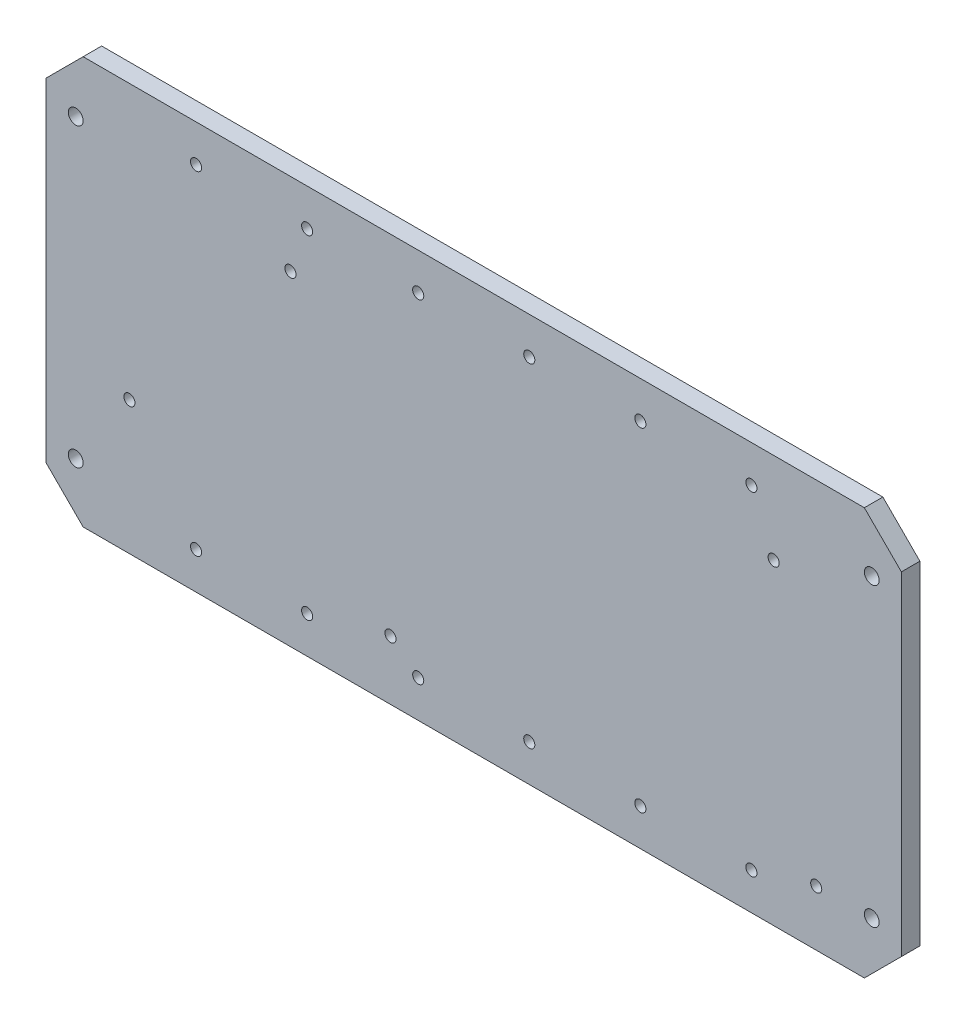
ISO-10303-21;
HEADER;
FILE_DESCRIPTION(('STEP AP214'),'2;1');
FILE_NAME('part.step','',(''),(''),'','','');
FILE_SCHEMA(('AUTOMOTIVE_DESIGN { 1 0 10303 214 1 1 1 1 }'));
ENDSEC;
DATA;
#1=APPLICATION_CONTEXT('core data for automotive mechanical design processes');
#2=APPLICATION_PROTOCOL_DEFINITION('international standard','automotive_design',2000,#1);
#3=PRODUCT_CONTEXT('',#1,'mechanical');
#4=PRODUCT('Part','Part','',(#3));
#5=PRODUCT_RELATED_PRODUCT_CATEGORY('part','',(#4));
#6=PRODUCT_DEFINITION_FORMATION('','',#4);
#7=PRODUCT_DEFINITION_CONTEXT('part definition',#1,'design');
#8=PRODUCT_DEFINITION('design','',#6,#7);
#9=PRODUCT_DEFINITION_SHAPE('','',#8);
#10=(LENGTH_UNIT() NAMED_UNIT(*) SI_UNIT(.MILLI.,.METRE.));
#11=(NAMED_UNIT(*) PLANE_ANGLE_UNIT() SI_UNIT($,.RADIAN.));
#12=(NAMED_UNIT(*) SI_UNIT($,.STERADIAN.) SOLID_ANGLE_UNIT());
#13=UNCERTAINTY_MEASURE_WITH_UNIT(LENGTH_MEASURE(1.E-05),#10,'distance_accuracy_value','');
#14=(GEOMETRIC_REPRESENTATION_CONTEXT(3) GLOBAL_UNCERTAINTY_ASSIGNED_CONTEXT((#13)) GLOBAL_UNIT_ASSIGNED_CONTEXT((#10,
#11,#12)) REPRESENTATION_CONTEXT('',''));
#15=CARTESIAN_POINT('',(0.,0.,0.));
#16=DIRECTION('',(0.,0.,1.));
#17=DIRECTION('',(1.,0.,0.));
#18=AXIS2_PLACEMENT_3D('',#15,#16,#17);
#19=CARTESIAN_POINT('',(0.,0.,5.));
#20=DIRECTION('',(0.,0.,-1.));
#21=DIRECTION('',(-1.,0.,0.));
#22=AXIS2_PLACEMENT_3D('',#19,#20,#21);
#23=PLANE('',#22);
#24=DIRECTION('',(0.,-1.,0.));
#25=VECTOR('',#24,1.);
#26=CARTESIAN_POINT('',(0.,0.,5.));
#27=LINE('',#26,#25);
#28=CARTESIAN_POINT('',(0.,100.,5.));
#29=VERTEX_POINT('',#28);
#30=CARTESIAN_POINT('',(0.,10.,5.));
#31=VERTEX_POINT('',#30);
#32=EDGE_CURVE('E137',#29,#31,#27,.T.);
#33=ORIENTED_EDGE('',*,*,#32,.T.);
#34=DIRECTION('',(-0.707106781186548,0.707106781186548,0.));
#35=VECTOR('',#34,1.);
#36=CARTESIAN_POINT('',(10.,0.,5.));
#37=LINE('',#36,#35);
#38=CARTESIAN_POINT('',(10.,0.,5.));
#39=VERTEX_POINT('',#38);
#40=EDGE_CURVE('E152',#31,#39,#37,.F.);
#41=ORIENTED_EDGE('',*,*,#40,.T.);
#42=DIRECTION('',(1.,0.,0.));
#43=VECTOR('',#42,1.);
#44=CARTESIAN_POINT('',(0.,0.,5.));
#45=LINE('',#44,#43);
#46=CARTESIAN_POINT('',(221.,0.,5.));
#47=VERTEX_POINT('',#46);
#48=EDGE_CURVE('E119',#39,#47,#45,.T.);
#49=ORIENTED_EDGE('',*,*,#48,.T.);
#50=DIRECTION('',(-0.707106781186548,-0.707106781186548,0.));
#51=VECTOR('',#50,1.);
#52=CARTESIAN_POINT('',(231.,10.,5.));
#53=LINE('',#52,#51);
#54=CARTESIAN_POINT('',(231.,10.,5.));
#55=VERTEX_POINT('',#54);
#56=EDGE_CURVE('E150',#47,#55,#53,.F.);
#57=ORIENTED_EDGE('',*,*,#56,.T.);
#58=DIRECTION('',(0.,1.,0.));
#59=VECTOR('',#58,1.);
#60=CARTESIAN_POINT('',(231.,0.,5.));
#61=LINE('',#60,#59);
#62=CARTESIAN_POINT('',(231.,100.,5.));
#63=VERTEX_POINT('',#62);
#64=EDGE_CURVE('E163',#55,#63,#61,.T.);
#65=ORIENTED_EDGE('',*,*,#64,.T.);
#66=DIRECTION('',(0.707106781186548,-0.707106781186548,0.));
#67=VECTOR('',#66,1.);
#68=CARTESIAN_POINT('',(221.,110.,5.));
#69=LINE('',#68,#67);
#70=CARTESIAN_POINT('',(221.,110.,5.));
#71=VERTEX_POINT('',#70);
#72=EDGE_CURVE('E54',#63,#71,#69,.F.);
#73=ORIENTED_EDGE('',*,*,#72,.T.);
#74=DIRECTION('',(-1.,0.,0.));
#75=VECTOR('',#74,1.);
#76=CARTESIAN_POINT('',(0.,110.,5.));
#77=LINE('',#76,#75);
#78=CARTESIAN_POINT('',(10.,110.,5.));
#79=VERTEX_POINT('',#78);
#80=EDGE_CURVE('E138',#71,#79,#77,.T.);
#81=ORIENTED_EDGE('',*,*,#80,.T.);
#82=DIRECTION('',(0.70710678118655,0.707106781186545,0.));
#83=VECTOR('',#82,1.);
#84=CARTESIAN_POINT('',(0.,100.,5.));
#85=LINE('',#84,#83);
#86=EDGE_CURVE('E147',#79,#29,#85,.F.);
#87=ORIENTED_EDGE('',*,*,#86,.T.);
#88=EDGE_LOOP('',(#33,#41,#49,#57,#65,#73,#81,#87));
#89=FACE_BOUND('',#88,.T.);
#90=CARTESIAN_POINT('',(196.5,85.5,5.));
#91=DIRECTION('',(0.,0.,1.));
#92=DIRECTION('',(1.,0.,0.));
#93=AXIS2_PLACEMENT_3D('',#90,#91,#92);
#94=CIRCLE('',#93,1.5);
#95=CARTESIAN_POINT('',(198.,85.5,5.));
#96=VERTEX_POINT('',#95);
#97=EDGE_CURVE('E132',#96,#96,#94,.T.);
#98=ORIENTED_EDGE('',*,*,#97,.F.);
#99=EDGE_LOOP('',(#98));
#100=FACE_BOUND('',#99,.T.);
#101=CARTESIAN_POINT('',(93.,16.,5.));
#102=DIRECTION('',(0.,0.,1.));
#103=DIRECTION('',(1.,0.,0.));
#104=AXIS2_PLACEMENT_3D('',#101,#102,#103);
#105=CIRCLE('',#104,1.5);
#106=CARTESIAN_POINT('',(94.5,16.,5.));
#107=VERTEX_POINT('',#106);
#108=EDGE_CURVE('E180',#107,#107,#105,.T.);
#109=ORIENTED_EDGE('',*,*,#108,.F.);
#110=EDGE_LOOP('',(#109));
#111=FACE_BOUND('',#110,.T.);
#112=CARTESIAN_POINT('',(66.,87.8,5.));
#113=DIRECTION('',(0.,0.,1.));
#114=DIRECTION('',(1.,0.,0.));
#115=AXIS2_PLACEMENT_3D('',#112,#113,#114);
#116=CIRCLE('',#115,1.5);
#117=CARTESIAN_POINT('',(67.5,87.8,5.));
#118=VERTEX_POINT('',#117);
#119=EDGE_CURVE('E186',#118,#118,#116,.T.);
#120=ORIENTED_EDGE('',*,*,#119,.F.);
#121=EDGE_LOOP('',(#120));
#122=FACE_BOUND('',#121,.T.);
#123=CARTESIAN_POINT('',(22.5,36.,5.));
#124=DIRECTION('',(0.,0.,1.));
#125=DIRECTION('',(1.,0.,0.));
#126=AXIS2_PLACEMENT_3D('',#123,#124,#125);
#127=CIRCLE('',#126,1.5);
#128=CARTESIAN_POINT('',(24.,36.,5.));
#129=VERTEX_POINT('',#128);
#130=EDGE_CURVE('E192',#129,#129,#127,.T.);
#131=ORIENTED_EDGE('',*,*,#130,.F.);
#132=EDGE_LOOP('',(#131));
#133=FACE_BOUND('',#132,.T.);
#134=CARTESIAN_POINT('',(223.,95.,5.));
#135=DIRECTION('',(0.,0.,1.));
#136=DIRECTION('',(1.,0.,0.));
#137=AXIS2_PLACEMENT_3D('',#134,#135,#136);
#138=CIRCLE('',#137,2.);
#139=CARTESIAN_POINT('',(225.,95.,5.));
#140=VERTEX_POINT('',#139);
#141=EDGE_CURVE('E198',#140,#140,#138,.T.);
#142=ORIENTED_EDGE('',*,*,#141,.F.);
#143=EDGE_LOOP('',(#142));
#144=FACE_BOUND('',#143,.T.);
#145=CARTESIAN_POINT('',(223.,15.,5.));
#146=DIRECTION('',(0.,0.,1.));
#147=DIRECTION('',(1.,0.,0.));
#148=AXIS2_PLACEMENT_3D('',#145,#146,#147);
#149=CIRCLE('',#148,2.);
#150=CARTESIAN_POINT('',(225.,15.,5.));
#151=VERTEX_POINT('',#150);
#152=EDGE_CURVE('E204',#151,#151,#149,.T.);
#153=ORIENTED_EDGE('',*,*,#152,.F.);
#154=EDGE_LOOP('',(#153));
#155=FACE_BOUND('',#154,.T.);
#156=CARTESIAN_POINT('',(8.00000000000001,95.,5.));
#157=DIRECTION('',(0.,0.,1.));
#158=DIRECTION('',(-1.,0.,0.));
#159=AXIS2_PLACEMENT_3D('',#156,#157,#158);
#160=CIRCLE('',#159,2.);
#161=CARTESIAN_POINT('',(6.00000000000001,95.,5.));
#162=VERTEX_POINT('',#161);
#163=EDGE_CURVE('E210',#162,#162,#160,.T.);
#164=ORIENTED_EDGE('',*,*,#163,.F.);
#165=EDGE_LOOP('',(#164));
#166=FACE_BOUND('',#165,.T.);
#167=CARTESIAN_POINT('',(8.00000000000001,15.,5.));
#168=DIRECTION('',(0.,0.,1.));
#169=DIRECTION('',(-1.,0.,0.));
#170=AXIS2_PLACEMENT_3D('',#167,#168,#169);
#171=CIRCLE('',#170,2.);
#172=CARTESIAN_POINT('',(6.00000000000001,15.,5.));
#173=VERTEX_POINT('',#172);
#174=EDGE_CURVE('E216',#173,#173,#171,.T.);
#175=ORIENTED_EDGE('',*,*,#174,.F.);
#176=EDGE_LOOP('',(#175));
#177=FACE_BOUND('',#176,.T.);
#178=CARTESIAN_POINT('',(208.,15.,5.));
#179=DIRECTION('',(0.,0.,1.));
#180=DIRECTION('',(1.,0.,0.));
#181=AXIS2_PLACEMENT_3D('',#178,#179,#180);
#182=CIRCLE('',#181,1.5);
#183=CARTESIAN_POINT('',(209.5,15.,5.));
#184=VERTEX_POINT('',#183);
#185=EDGE_CURVE('E222',#184,#184,#182,.T.);
#186=ORIENTED_EDGE('',*,*,#185,.F.);
#187=EDGE_LOOP('',(#186));
#188=FACE_BOUND('',#187,.T.);
#189=CARTESIAN_POINT('',(130.5,100.,5.));
#190=DIRECTION('',(0.,0.,1.));
#191=DIRECTION('',(1.,0.,0.));
#192=AXIS2_PLACEMENT_3D('',#189,#190,#191);
#193=CIRCLE('',#192,1.5);
#194=CARTESIAN_POINT('',(132.,100.,5.));
#195=VERTEX_POINT('',#194);
#196=EDGE_CURVE('E228',#195,#195,#193,.T.);
#197=ORIENTED_EDGE('',*,*,#196,.F.);
#198=EDGE_LOOP('',(#197));
#199=FACE_BOUND('',#198,.T.);
#200=CARTESIAN_POINT('',(160.5,100.,5.));
#201=DIRECTION('',(0.,0.,1.));
#202=DIRECTION('',(1.,0.,0.));
#203=AXIS2_PLACEMENT_3D('',#200,#201,#202);
#204=CIRCLE('',#203,1.5);
#205=CARTESIAN_POINT('',(162.,100.,5.));
#206=VERTEX_POINT('',#205);
#207=EDGE_CURVE('E234',#206,#206,#204,.T.);
#208=ORIENTED_EDGE('',*,*,#207,.F.);
#209=EDGE_LOOP('',(#208));
#210=FACE_BOUND('',#209,.T.);
#211=CARTESIAN_POINT('',(190.5,100.,5.));
#212=DIRECTION('',(0.,0.,1.));
#213=DIRECTION('',(1.,0.,0.));
#214=AXIS2_PLACEMENT_3D('',#211,#212,#213);
#215=CIRCLE('',#214,1.5);
#216=CARTESIAN_POINT('',(192.,100.,5.));
#217=VERTEX_POINT('',#216);
#218=EDGE_CURVE('E240',#217,#217,#215,.T.);
#219=ORIENTED_EDGE('',*,*,#218,.F.);
#220=EDGE_LOOP('',(#219));
#221=FACE_BOUND('',#220,.T.);
#222=CARTESIAN_POINT('',(40.5,100.,5.));
#223=DIRECTION('',(0.,0.,1.));
#224=DIRECTION('',(-1.,0.,0.));
#225=AXIS2_PLACEMENT_3D('',#222,#223,#224);
#226=CIRCLE('',#225,1.5);
#227=CARTESIAN_POINT('',(39.,100.,5.));
#228=VERTEX_POINT('',#227);
#229=EDGE_CURVE('E246',#228,#228,#226,.T.);
#230=ORIENTED_EDGE('',*,*,#229,.F.);
#231=EDGE_LOOP('',(#230));
#232=FACE_BOUND('',#231,.T.);
#233=CARTESIAN_POINT('',(70.5,100.,5.));
#234=DIRECTION('',(0.,0.,1.));
#235=DIRECTION('',(-1.,0.,0.));
#236=AXIS2_PLACEMENT_3D('',#233,#234,#235);
#237=CIRCLE('',#236,1.5);
#238=CARTESIAN_POINT('',(69.,100.,5.));
#239=VERTEX_POINT('',#238);
#240=EDGE_CURVE('E252',#239,#239,#237,.T.);
#241=ORIENTED_EDGE('',*,*,#240,.F.);
#242=EDGE_LOOP('',(#241));
#243=FACE_BOUND('',#242,.T.);
#244=CARTESIAN_POINT('',(100.5,100.,5.));
#245=DIRECTION('',(0.,0.,1.));
#246=DIRECTION('',(-1.,0.,0.));
#247=AXIS2_PLACEMENT_3D('',#244,#245,#246);
#248=CIRCLE('',#247,1.5);
#249=CARTESIAN_POINT('',(99.,100.,5.));
#250=VERTEX_POINT('',#249);
#251=EDGE_CURVE('E258',#250,#250,#248,.T.);
#252=ORIENTED_EDGE('',*,*,#251,.F.);
#253=EDGE_LOOP('',(#252));
#254=FACE_BOUND('',#253,.T.);
#255=CARTESIAN_POINT('',(100.5,9.99999999999999,5.));
#256=DIRECTION('',(0.,0.,1.));
#257=DIRECTION('',(1.,0.,0.));
#258=AXIS2_PLACEMENT_3D('',#255,#256,#257);
#259=CIRCLE('',#258,1.5);
#260=CARTESIAN_POINT('',(102.,9.99999999999999,5.));
#261=VERTEX_POINT('',#260);
#262=EDGE_CURVE('E264',#261,#261,#259,.T.);
#263=ORIENTED_EDGE('',*,*,#262,.F.);
#264=EDGE_LOOP('',(#263));
#265=FACE_BOUND('',#264,.T.);
#266=CARTESIAN_POINT('',(70.5,9.99999999999999,5.));
#267=DIRECTION('',(0.,0.,1.));
#268=DIRECTION('',(1.,0.,0.));
#269=AXIS2_PLACEMENT_3D('',#266,#267,#268);
#270=CIRCLE('',#269,1.5);
#271=CARTESIAN_POINT('',(72.,9.99999999999999,5.));
#272=VERTEX_POINT('',#271);
#273=EDGE_CURVE('E270',#272,#272,#270,.T.);
#274=ORIENTED_EDGE('',*,*,#273,.F.);
#275=EDGE_LOOP('',(#274));
#276=FACE_BOUND('',#275,.T.);
#277=CARTESIAN_POINT('',(40.5,9.99999999999999,5.));
#278=DIRECTION('',(0.,0.,1.));
#279=DIRECTION('',(1.,0.,0.));
#280=AXIS2_PLACEMENT_3D('',#277,#278,#279);
#281=CIRCLE('',#280,1.5);
#282=CARTESIAN_POINT('',(42.,9.99999999999999,5.));
#283=VERTEX_POINT('',#282);
#284=EDGE_CURVE('E276',#283,#283,#281,.T.);
#285=ORIENTED_EDGE('',*,*,#284,.F.);
#286=EDGE_LOOP('',(#285));
#287=FACE_BOUND('',#286,.T.);
#288=CARTESIAN_POINT('',(190.5,9.99999999999999,5.));
#289=DIRECTION('',(0.,0.,1.));
#290=DIRECTION('',(-1.,0.,0.));
#291=AXIS2_PLACEMENT_3D('',#288,#289,#290);
#292=CIRCLE('',#291,1.5);
#293=CARTESIAN_POINT('',(189.,9.99999999999999,5.));
#294=VERTEX_POINT('',#293);
#295=EDGE_CURVE('E282',#294,#294,#292,.T.);
#296=ORIENTED_EDGE('',*,*,#295,.F.);
#297=EDGE_LOOP('',(#296));
#298=FACE_BOUND('',#297,.T.);
#299=CARTESIAN_POINT('',(160.5,9.99999999999999,5.));
#300=DIRECTION('',(0.,0.,1.));
#301=DIRECTION('',(-1.,0.,0.));
#302=AXIS2_PLACEMENT_3D('',#299,#300,#301);
#303=CIRCLE('',#302,1.5);
#304=CARTESIAN_POINT('',(159.,9.99999999999999,5.));
#305=VERTEX_POINT('',#304);
#306=EDGE_CURVE('E288',#305,#305,#303,.T.);
#307=ORIENTED_EDGE('',*,*,#306,.F.);
#308=EDGE_LOOP('',(#307));
#309=FACE_BOUND('',#308,.T.);
#310=CARTESIAN_POINT('',(130.5,9.99999999999999,5.));
#311=DIRECTION('',(0.,0.,1.));
#312=DIRECTION('',(-1.,0.,0.));
#313=AXIS2_PLACEMENT_3D('',#310,#311,#312);
#314=CIRCLE('',#313,1.5);
#315=CARTESIAN_POINT('',(129.,9.99999999999999,5.));
#316=VERTEX_POINT('',#315);
#317=EDGE_CURVE('E294',#316,#316,#314,.T.);
#318=ORIENTED_EDGE('',*,*,#317,.F.);
#319=EDGE_LOOP('',(#318));
#320=FACE_BOUND('',#319,.T.);
#321=ADVANCED_FACE('F33',(#89,#100,#111,#122,#133,#144,#155,#166,#177,#188,#199,#210,#221,#232,
#243,#254,#265,#276,#287,#298,#309,#320),#23,.F.);
#322=CARTESIAN_POINT('',(0.,0.,0.));
#323=DIRECTION('',(0.,0.,-1.));
#324=DIRECTION('',(-1.,0.,0.));
#325=AXIS2_PLACEMENT_3D('',#322,#323,#324);
#326=PLANE('',#325);
#327=CARTESIAN_POINT('',(160.5,9.99999999999999,0.));
#328=DIRECTION('',(0.,0.,1.));
#329=DIRECTION('',(-1.,0.,0.));
#330=AXIS2_PLACEMENT_3D('',#327,#328,#329);
#331=CIRCLE('',#330,1.5);
#332=CARTESIAN_POINT('',(159.,9.99999999999999,0.));
#333=VERTEX_POINT('',#332);
#334=EDGE_CURVE('E291',#333,#333,#331,.T.);
#335=ORIENTED_EDGE('',*,*,#334,.T.);
#336=EDGE_LOOP('',(#335));
#337=FACE_BOUND('',#336,.T.);
#338=CARTESIAN_POINT('',(40.5,9.99999999999999,0.));
#339=DIRECTION('',(0.,0.,1.));
#340=DIRECTION('',(1.,0.,0.));
#341=AXIS2_PLACEMENT_3D('',#338,#339,#340);
#342=CIRCLE('',#341,1.5);
#343=CARTESIAN_POINT('',(42.,9.99999999999999,0.));
#344=VERTEX_POINT('',#343);
#345=EDGE_CURVE('E279',#344,#344,#342,.T.);
#346=ORIENTED_EDGE('',*,*,#345,.T.);
#347=EDGE_LOOP('',(#346));
#348=FACE_BOUND('',#347,.T.);
#349=CARTESIAN_POINT('',(100.5,9.99999999999999,0.));
#350=DIRECTION('',(0.,0.,1.));
#351=DIRECTION('',(1.,0.,0.));
#352=AXIS2_PLACEMENT_3D('',#349,#350,#351);
#353=CIRCLE('',#352,1.5);
#354=CARTESIAN_POINT('',(102.,9.99999999999999,0.));
#355=VERTEX_POINT('',#354);
#356=EDGE_CURVE('E267',#355,#355,#353,.T.);
#357=ORIENTED_EDGE('',*,*,#356,.T.);
#358=EDGE_LOOP('',(#357));
#359=FACE_BOUND('',#358,.T.);
#360=CARTESIAN_POINT('',(70.5,100.,0.));
#361=DIRECTION('',(0.,0.,1.));
#362=DIRECTION('',(-1.,0.,0.));
#363=AXIS2_PLACEMENT_3D('',#360,#361,#362);
#364=CIRCLE('',#363,1.5);
#365=CARTESIAN_POINT('',(69.,100.,0.));
#366=VERTEX_POINT('',#365);
#367=EDGE_CURVE('E255',#366,#366,#364,.T.);
#368=ORIENTED_EDGE('',*,*,#367,.T.);
#369=EDGE_LOOP('',(#368));
#370=FACE_BOUND('',#369,.T.);
#371=CARTESIAN_POINT('',(190.5,100.,0.));
#372=DIRECTION('',(0.,0.,1.));
#373=DIRECTION('',(1.,0.,0.));
#374=AXIS2_PLACEMENT_3D('',#371,#372,#373);
#375=CIRCLE('',#374,1.5);
#376=CARTESIAN_POINT('',(192.,100.,0.));
#377=VERTEX_POINT('',#376);
#378=EDGE_CURVE('E243',#377,#377,#375,.T.);
#379=ORIENTED_EDGE('',*,*,#378,.T.);
#380=EDGE_LOOP('',(#379));
#381=FACE_BOUND('',#380,.T.);
#382=CARTESIAN_POINT('',(130.5,100.,0.));
#383=DIRECTION('',(0.,0.,1.));
#384=DIRECTION('',(1.,0.,0.));
#385=AXIS2_PLACEMENT_3D('',#382,#383,#384);
#386=CIRCLE('',#385,1.5);
#387=CARTESIAN_POINT('',(132.,100.,0.));
#388=VERTEX_POINT('',#387);
#389=EDGE_CURVE('E231',#388,#388,#386,.T.);
#390=ORIENTED_EDGE('',*,*,#389,.T.);
#391=EDGE_LOOP('',(#390));
#392=FACE_BOUND('',#391,.T.);
#393=CARTESIAN_POINT('',(8.00000000000001,15.,0.));
#394=DIRECTION('',(0.,0.,1.));
#395=DIRECTION('',(-1.,0.,0.));
#396=AXIS2_PLACEMENT_3D('',#393,#394,#395);
#397=CIRCLE('',#396,2.);
#398=CARTESIAN_POINT('',(6.00000000000001,15.,0.));
#399=VERTEX_POINT('',#398);
#400=EDGE_CURVE('E219',#399,#399,#397,.T.);
#401=ORIENTED_EDGE('',*,*,#400,.T.);
#402=EDGE_LOOP('',(#401));
#403=FACE_BOUND('',#402,.T.);
#404=CARTESIAN_POINT('',(223.,15.,0.));
#405=DIRECTION('',(0.,0.,1.));
#406=DIRECTION('',(1.,0.,0.));
#407=AXIS2_PLACEMENT_3D('',#404,#405,#406);
#408=CIRCLE('',#407,2.);
#409=CARTESIAN_POINT('',(225.,15.,0.));
#410=VERTEX_POINT('',#409);
#411=EDGE_CURVE('E207',#410,#410,#408,.T.);
#412=ORIENTED_EDGE('',*,*,#411,.T.);
#413=EDGE_LOOP('',(#412));
#414=FACE_BOUND('',#413,.T.);
#415=CARTESIAN_POINT('',(22.5,36.,0.));
#416=DIRECTION('',(0.,0.,1.));
#417=DIRECTION('',(1.,0.,0.));
#418=AXIS2_PLACEMENT_3D('',#415,#416,#417);
#419=CIRCLE('',#418,1.5);
#420=CARTESIAN_POINT('',(24.,36.,0.));
#421=VERTEX_POINT('',#420);
#422=EDGE_CURVE('E195',#421,#421,#419,.T.);
#423=ORIENTED_EDGE('',*,*,#422,.T.);
#424=EDGE_LOOP('',(#423));
#425=FACE_BOUND('',#424,.T.);
#426=CARTESIAN_POINT('',(93.,16.,0.));
#427=DIRECTION('',(0.,0.,1.));
#428=DIRECTION('',(1.,0.,0.));
#429=AXIS2_PLACEMENT_3D('',#426,#427,#428);
#430=CIRCLE('',#429,1.5);
#431=CARTESIAN_POINT('',(94.5,16.,0.));
#432=VERTEX_POINT('',#431);
#433=EDGE_CURVE('E183',#432,#432,#430,.T.);
#434=ORIENTED_EDGE('',*,*,#433,.T.);
#435=EDGE_LOOP('',(#434));
#436=FACE_BOUND('',#435,.T.);
#437=DIRECTION('',(1.,0.,0.));
#438=VECTOR('',#437,1.);
#439=CARTESIAN_POINT('',(0.,0.,0.));
#440=LINE('',#439,#438);
#441=CARTESIAN_POINT('',(10.,0.,0.));
#442=VERTEX_POINT('',#441);
#443=CARTESIAN_POINT('',(221.,0.,0.));
#444=VERTEX_POINT('',#443);
#445=EDGE_CURVE('E116',#442,#444,#440,.T.);
#446=ORIENTED_EDGE('',*,*,#445,.F.);
#447=DIRECTION('',(0.707106781186548,-0.707106781186548,0.));
#448=VECTOR('',#447,1.);
#449=CARTESIAN_POINT('',(5.,5.,0.));
#450=LINE('',#449,#448);
#451=CARTESIAN_POINT('',(0.,10.,0.));
#452=VERTEX_POINT('',#451);
#453=EDGE_CURVE('E99',#442,#452,#450,.F.);
#454=ORIENTED_EDGE('',*,*,#453,.T.);
#455=DIRECTION('',(0.,-1.,0.));
#456=VECTOR('',#455,1.);
#457=CARTESIAN_POINT('',(0.,0.,0.));
#458=LINE('',#457,#456);
#459=CARTESIAN_POINT('',(0.,100.,0.));
#460=VERTEX_POINT('',#459);
#461=EDGE_CURVE('E127',#460,#452,#458,.T.);
#462=ORIENTED_EDGE('',*,*,#461,.F.);
#463=DIRECTION('',(-0.70710678118655,-0.707106781186545,0.));
#464=VECTOR('',#463,1.);
#465=CARTESIAN_POINT('',(-50.,50.0000000000005,0.));
#466=LINE('',#465,#464);
#467=CARTESIAN_POINT('',(10.,110.,0.));
#468=VERTEX_POINT('',#467);
#469=EDGE_CURVE('E120',#460,#468,#466,.F.);
#470=ORIENTED_EDGE('',*,*,#469,.T.);
#471=DIRECTION('',(-1.,0.,0.));
#472=VECTOR('',#471,1.);
#473=CARTESIAN_POINT('',(0.,110.,0.));
#474=LINE('',#473,#472);
#475=CARTESIAN_POINT('',(221.,110.,0.));
#476=VERTEX_POINT('',#475);
#477=EDGE_CURVE('E130',#476,#468,#474,.T.);
#478=ORIENTED_EDGE('',*,*,#477,.F.);
#479=DIRECTION('',(-0.707106781186548,0.707106781186548,0.));
#480=VECTOR('',#479,1.);
#481=CARTESIAN_POINT('',(165.5,165.5,0.));
#482=LINE('',#481,#480);
#483=CARTESIAN_POINT('',(231.,100.,0.));
#484=VERTEX_POINT('',#483);
#485=EDGE_CURVE('E141',#476,#484,#482,.F.);
#486=ORIENTED_EDGE('',*,*,#485,.T.);
#487=DIRECTION('',(0.,1.,0.));
#488=VECTOR('',#487,1.);
#489=CARTESIAN_POINT('',(231.,0.,0.));
#490=LINE('',#489,#488);
#491=CARTESIAN_POINT('',(231.,10.,0.));
#492=VERTEX_POINT('',#491);
#493=EDGE_CURVE('E126',#492,#484,#490,.T.);
#494=ORIENTED_EDGE('',*,*,#493,.F.);
#495=DIRECTION('',(0.707106781186548,0.707106781186548,0.));
#496=VECTOR('',#495,1.);
#497=CARTESIAN_POINT('',(110.5,-110.5,0.));
#498=LINE('',#497,#496);
#499=EDGE_CURVE('E110',#492,#444,#498,.F.);
#500=ORIENTED_EDGE('',*,*,#499,.T.);
#501=EDGE_LOOP('',(#446,#454,#462,#470,#478,#486,#494,#500));
#502=FACE_BOUND('',#501,.T.);
#503=CARTESIAN_POINT('',(196.5,85.5,0.));
#504=DIRECTION('',(0.,0.,1.));
#505=DIRECTION('',(1.,0.,0.));
#506=AXIS2_PLACEMENT_3D('',#503,#504,#505);
#507=CIRCLE('',#506,1.5);
#508=CARTESIAN_POINT('',(198.,85.5,0.));
#509=VERTEX_POINT('',#508);
#510=EDGE_CURVE('E177',#509,#509,#507,.T.);
#511=ORIENTED_EDGE('',*,*,#510,.T.);
#512=EDGE_LOOP('',(#511));
#513=FACE_BOUND('',#512,.T.);
#514=CARTESIAN_POINT('',(66.,87.8,0.));
#515=DIRECTION('',(0.,0.,1.));
#516=DIRECTION('',(1.,0.,0.));
#517=AXIS2_PLACEMENT_3D('',#514,#515,#516);
#518=CIRCLE('',#517,1.5);
#519=CARTESIAN_POINT('',(67.5,87.8,0.));
#520=VERTEX_POINT('',#519);
#521=EDGE_CURVE('E189',#520,#520,#518,.T.);
#522=ORIENTED_EDGE('',*,*,#521,.T.);
#523=EDGE_LOOP('',(#522));
#524=FACE_BOUND('',#523,.T.);
#525=CARTESIAN_POINT('',(223.,95.,0.));
#526=DIRECTION('',(0.,0.,1.));
#527=DIRECTION('',(1.,0.,0.));
#528=AXIS2_PLACEMENT_3D('',#525,#526,#527);
#529=CIRCLE('',#528,2.);
#530=CARTESIAN_POINT('',(225.,95.,0.));
#531=VERTEX_POINT('',#530);
#532=EDGE_CURVE('E201',#531,#531,#529,.T.);
#533=ORIENTED_EDGE('',*,*,#532,.T.);
#534=EDGE_LOOP('',(#533));
#535=FACE_BOUND('',#534,.T.);
#536=CARTESIAN_POINT('',(8.00000000000001,95.,0.));
#537=DIRECTION('',(0.,0.,1.));
#538=DIRECTION('',(-1.,0.,0.));
#539=AXIS2_PLACEMENT_3D('',#536,#537,#538);
#540=CIRCLE('',#539,2.);
#541=CARTESIAN_POINT('',(6.00000000000001,95.,0.));
#542=VERTEX_POINT('',#541);
#543=EDGE_CURVE('E213',#542,#542,#540,.T.);
#544=ORIENTED_EDGE('',*,*,#543,.T.);
#545=EDGE_LOOP('',(#544));
#546=FACE_BOUND('',#545,.T.);
#547=CARTESIAN_POINT('',(208.,15.,0.));
#548=DIRECTION('',(0.,0.,1.));
#549=DIRECTION('',(1.,0.,0.));
#550=AXIS2_PLACEMENT_3D('',#547,#548,#549);
#551=CIRCLE('',#550,1.5);
#552=CARTESIAN_POINT('',(209.5,15.,0.));
#553=VERTEX_POINT('',#552);
#554=EDGE_CURVE('E225',#553,#553,#551,.T.);
#555=ORIENTED_EDGE('',*,*,#554,.T.);
#556=EDGE_LOOP('',(#555));
#557=FACE_BOUND('',#556,.T.);
#558=CARTESIAN_POINT('',(160.5,100.,0.));
#559=DIRECTION('',(0.,0.,1.));
#560=DIRECTION('',(1.,0.,0.));
#561=AXIS2_PLACEMENT_3D('',#558,#559,#560);
#562=CIRCLE('',#561,1.5);
#563=CARTESIAN_POINT('',(162.,100.,0.));
#564=VERTEX_POINT('',#563);
#565=EDGE_CURVE('E237',#564,#564,#562,.T.);
#566=ORIENTED_EDGE('',*,*,#565,.T.);
#567=EDGE_LOOP('',(#566));
#568=FACE_BOUND('',#567,.T.);
#569=CARTESIAN_POINT('',(40.5,100.,0.));
#570=DIRECTION('',(0.,0.,1.));
#571=DIRECTION('',(-1.,0.,0.));
#572=AXIS2_PLACEMENT_3D('',#569,#570,#571);
#573=CIRCLE('',#572,1.5);
#574=CARTESIAN_POINT('',(39.,100.,0.));
#575=VERTEX_POINT('',#574);
#576=EDGE_CURVE('E249',#575,#575,#573,.T.);
#577=ORIENTED_EDGE('',*,*,#576,.T.);
#578=EDGE_LOOP('',(#577));
#579=FACE_BOUND('',#578,.T.);
#580=CARTESIAN_POINT('',(100.5,100.,0.));
#581=DIRECTION('',(0.,0.,1.));
#582=DIRECTION('',(-1.,0.,0.));
#583=AXIS2_PLACEMENT_3D('',#580,#581,#582);
#584=CIRCLE('',#583,1.5);
#585=CARTESIAN_POINT('',(99.,100.,0.));
#586=VERTEX_POINT('',#585);
#587=EDGE_CURVE('E261',#586,#586,#584,.T.);
#588=ORIENTED_EDGE('',*,*,#587,.T.);
#589=EDGE_LOOP('',(#588));
#590=FACE_BOUND('',#589,.T.);
#591=CARTESIAN_POINT('',(70.5,9.99999999999999,0.));
#592=DIRECTION('',(0.,0.,1.));
#593=DIRECTION('',(1.,0.,0.));
#594=AXIS2_PLACEMENT_3D('',#591,#592,#593);
#595=CIRCLE('',#594,1.5);
#596=CARTESIAN_POINT('',(72.,9.99999999999999,0.));
#597=VERTEX_POINT('',#596);
#598=EDGE_CURVE('E273',#597,#597,#595,.T.);
#599=ORIENTED_EDGE('',*,*,#598,.T.);
#600=EDGE_LOOP('',(#599));
#601=FACE_BOUND('',#600,.T.);
#602=CARTESIAN_POINT('',(190.5,9.99999999999999,0.));
#603=DIRECTION('',(0.,0.,1.));
#604=DIRECTION('',(-1.,0.,0.));
#605=AXIS2_PLACEMENT_3D('',#602,#603,#604);
#606=CIRCLE('',#605,1.5);
#607=CARTESIAN_POINT('',(189.,9.99999999999999,0.));
#608=VERTEX_POINT('',#607);
#609=EDGE_CURVE('E285',#608,#608,#606,.T.);
#610=ORIENTED_EDGE('',*,*,#609,.T.);
#611=EDGE_LOOP('',(#610));
#612=FACE_BOUND('',#611,.T.);
#613=CARTESIAN_POINT('',(130.5,9.99999999999999,0.));
#614=DIRECTION('',(0.,0.,1.));
#615=DIRECTION('',(-1.,0.,0.));
#616=AXIS2_PLACEMENT_3D('',#613,#614,#615);
#617=CIRCLE('',#616,1.5);
#618=CARTESIAN_POINT('',(129.,9.99999999999999,0.));
#619=VERTEX_POINT('',#618);
#620=EDGE_CURVE('E297',#619,#619,#617,.T.);
#621=ORIENTED_EDGE('',*,*,#620,.T.);
#622=EDGE_LOOP('',(#621));
#623=FACE_BOUND('',#622,.T.);
#624=ADVANCED_FACE('F123',(#337,#348,#359,#370,#381,#392,#403,#414,#425,#436,#502,#513,#524,
#535,#546,#557,#568,#579,#590,#601,#612,#623),#326,.T.);
#625=CARTESIAN_POINT('',(0.,0.,5.));
#626=DIRECTION('',(1.,0.,0.));
#627=DIRECTION('',(0.,0.,-1.));
#628=AXIS2_PLACEMENT_3D('',#625,#626,#627);
#629=PLANE('',#628);
#630=ORIENTED_EDGE('',*,*,#461,.T.);
#631=DIRECTION('',(0.,0.,1.));
#632=VECTOR('',#631,1.);
#633=CARTESIAN_POINT('',(0.,10.,5.));
#634=LINE('',#633,#632);
#635=EDGE_CURVE('E104',#452,#31,#634,.T.);
#636=ORIENTED_EDGE('',*,*,#635,.T.);
#637=ORIENTED_EDGE('',*,*,#32,.F.);
#638=DIRECTION('',(0.,0.,-1.));
#639=VECTOR('',#638,1.);
#640=CARTESIAN_POINT('',(0.,100.,5.));
#641=LINE('',#640,#639);
#642=EDGE_CURVE('E109',#29,#460,#641,.T.);
#643=ORIENTED_EDGE('',*,*,#642,.T.);
#644=EDGE_LOOP('',(#630,#636,#637,#643));
#645=FACE_BOUND('',#644,.T.);
#646=ADVANCED_FACE('F311',(#645),#629,.F.);
#647=CARTESIAN_POINT('',(0.,0.,5.));
#648=DIRECTION('',(0.,1.,0.));
#649=DIRECTION('',(0.,0.,1.));
#650=AXIS2_PLACEMENT_3D('',#647,#648,#649);
#651=PLANE('',#650);
#652=ORIENTED_EDGE('',*,*,#48,.F.);
#653=DIRECTION('',(0.,0.,-1.));
#654=VECTOR('',#653,1.);
#655=CARTESIAN_POINT('',(10.,0.,5.));
#656=LINE('',#655,#654);
#657=EDGE_CURVE('E103',#39,#442,#656,.T.);
#658=ORIENTED_EDGE('',*,*,#657,.T.);
#659=ORIENTED_EDGE('',*,*,#445,.T.);
#660=DIRECTION('',(0.,0.,1.));
#661=VECTOR('',#660,1.);
#662=CARTESIAN_POINT('',(221.,0.,5.));
#663=LINE('',#662,#661);
#664=EDGE_CURVE('E121',#444,#47,#663,.T.);
#665=ORIENTED_EDGE('',*,*,#664,.T.);
#666=EDGE_LOOP('',(#652,#658,#659,#665));
#667=FACE_BOUND('',#666,.T.);
#668=ADVANCED_FACE('F115',(#667),#651,.F.);
#669=CARTESIAN_POINT('',(231.,0.,5.));
#670=DIRECTION('',(-1.,0.,0.));
#671=DIRECTION('',(0.,0.,1.));
#672=AXIS2_PLACEMENT_3D('',#669,#670,#671);
#673=PLANE('',#672);
#674=ORIENTED_EDGE('',*,*,#64,.F.);
#675=DIRECTION('',(0.,0.,-1.));
#676=VECTOR('',#675,1.);
#677=CARTESIAN_POINT('',(231.,10.,5.));
#678=LINE('',#677,#676);
#679=EDGE_CURVE('E156',#55,#492,#678,.T.);
#680=ORIENTED_EDGE('',*,*,#679,.T.);
#681=ORIENTED_EDGE('',*,*,#493,.T.);
#682=DIRECTION('',(0.,0.,1.));
#683=VECTOR('',#682,1.);
#684=CARTESIAN_POINT('',(231.,100.,5.));
#685=LINE('',#684,#683);
#686=EDGE_CURVE('E154',#484,#63,#685,.T.);
#687=ORIENTED_EDGE('',*,*,#686,.T.);
#688=EDGE_LOOP('',(#674,#680,#681,#687));
#689=FACE_BOUND('',#688,.T.);
#690=ADVANCED_FACE('F161',(#689),#673,.F.);
#691=CARTESIAN_POINT('',(0.,110.,5.));
#692=DIRECTION('',(0.,-1.,0.));
#693=DIRECTION('',(0.,0.,-1.));
#694=AXIS2_PLACEMENT_3D('',#691,#692,#693);
#695=PLANE('',#694);
#696=ORIENTED_EDGE('',*,*,#80,.F.);
#697=DIRECTION('',(0.,0.,-1.));
#698=VECTOR('',#697,1.);
#699=CARTESIAN_POINT('',(221.,110.,5.));
#700=LINE('',#699,#698);
#701=EDGE_CURVE('E11',#71,#476,#700,.T.);
#702=ORIENTED_EDGE('',*,*,#701,.T.);
#703=ORIENTED_EDGE('',*,*,#477,.T.);
#704=DIRECTION('',(0.,0.,1.));
#705=VECTOR('',#704,1.);
#706=CARTESIAN_POINT('',(10.,110.,5.));
#707=LINE('',#706,#705);
#708=EDGE_CURVE('E41',#468,#79,#707,.T.);
#709=ORIENTED_EDGE('',*,*,#708,.T.);
#710=EDGE_LOOP('',(#696,#702,#703,#709));
#711=FACE_BOUND('',#710,.T.);
#712=ADVANCED_FACE('F170',(#711),#695,.F.);
#713=CARTESIAN_POINT('',(196.5,85.5,5.));
#714=DIRECTION('',(0.,0.,-1.));
#715=DIRECTION('',(-1.,0.,0.));
#716=AXIS2_PLACEMENT_3D('',#713,#714,#715);
#717=CYLINDRICAL_SURFACE('',#716,1.5);
#718=ORIENTED_EDGE('',*,*,#97,.T.);
#719=EDGE_LOOP('',(#718));
#720=FACE_BOUND('',#719,.T.);
#721=ORIENTED_EDGE('',*,*,#510,.F.);
#722=EDGE_LOOP('',(#721));
#723=FACE_BOUND('',#722,.T.);
#724=ADVANCED_FACE('F316',(#720,#723),#717,.F.);
#725=CARTESIAN_POINT('',(93.,16.,5.));
#726=DIRECTION('',(0.,0.,-1.));
#727=DIRECTION('',(-1.,0.,0.));
#728=AXIS2_PLACEMENT_3D('',#725,#726,#727);
#729=CYLINDRICAL_SURFACE('',#728,1.5);
#730=ORIENTED_EDGE('',*,*,#108,.T.);
#731=EDGE_LOOP('',(#730));
#732=FACE_BOUND('',#731,.T.);
#733=ORIENTED_EDGE('',*,*,#433,.F.);
#734=EDGE_LOOP('',(#733));
#735=FACE_BOUND('',#734,.T.);
#736=ADVANCED_FACE('F581',(#732,#735),#729,.F.);
#737=CARTESIAN_POINT('',(66.,87.8,5.));
#738=DIRECTION('',(0.,0.,-1.));
#739=DIRECTION('',(-1.,0.,0.));
#740=AXIS2_PLACEMENT_3D('',#737,#738,#739);
#741=CYLINDRICAL_SURFACE('',#740,1.5);
#742=ORIENTED_EDGE('',*,*,#119,.T.);
#743=EDGE_LOOP('',(#742));
#744=FACE_BOUND('',#743,.T.);
#745=ORIENTED_EDGE('',*,*,#521,.F.);
#746=EDGE_LOOP('',(#745));
#747=FACE_BOUND('',#746,.T.);
#748=ADVANCED_FACE('F571',(#744,#747),#741,.F.);
#749=CARTESIAN_POINT('',(22.5,36.,5.));
#750=DIRECTION('',(0.,0.,-1.));
#751=DIRECTION('',(-1.,0.,0.));
#752=AXIS2_PLACEMENT_3D('',#749,#750,#751);
#753=CYLINDRICAL_SURFACE('',#752,1.5);
#754=ORIENTED_EDGE('',*,*,#130,.T.);
#755=EDGE_LOOP('',(#754));
#756=FACE_BOUND('',#755,.T.);
#757=ORIENTED_EDGE('',*,*,#422,.F.);
#758=EDGE_LOOP('',(#757));
#759=FACE_BOUND('',#758,.T.);
#760=ADVANCED_FACE('F561',(#756,#759),#753,.F.);
#761=CARTESIAN_POINT('',(223.,95.,5.));
#762=DIRECTION('',(0.,0.,-1.));
#763=DIRECTION('',(-1.,0.,0.));
#764=AXIS2_PLACEMENT_3D('',#761,#762,#763);
#765=CYLINDRICAL_SURFACE('',#764,2.);
#766=ORIENTED_EDGE('',*,*,#141,.T.);
#767=EDGE_LOOP('',(#766));
#768=FACE_BOUND('',#767,.T.);
#769=ORIENTED_EDGE('',*,*,#532,.F.);
#770=EDGE_LOOP('',(#769));
#771=FACE_BOUND('',#770,.T.);
#772=ADVANCED_FACE('F551',(#768,#771),#765,.F.);
#773=CARTESIAN_POINT('',(223.,15.,5.));
#774=DIRECTION('',(0.,0.,-1.));
#775=DIRECTION('',(-1.,0.,0.));
#776=AXIS2_PLACEMENT_3D('',#773,#774,#775);
#777=CYLINDRICAL_SURFACE('',#776,2.);
#778=ORIENTED_EDGE('',*,*,#152,.T.);
#779=EDGE_LOOP('',(#778));
#780=FACE_BOUND('',#779,.T.);
#781=ORIENTED_EDGE('',*,*,#411,.F.);
#782=EDGE_LOOP('',(#781));
#783=FACE_BOUND('',#782,.T.);
#784=ADVANCED_FACE('F541',(#780,#783),#777,.F.);
#785=CARTESIAN_POINT('',(8.00000000000001,95.,5.));
#786=DIRECTION('',(0.,0.,-1.));
#787=DIRECTION('',(-1.,0.,0.));
#788=AXIS2_PLACEMENT_3D('',#785,#786,#787);
#789=CYLINDRICAL_SURFACE('',#788,2.);
#790=ORIENTED_EDGE('',*,*,#163,.T.);
#791=EDGE_LOOP('',(#790));
#792=FACE_BOUND('',#791,.T.);
#793=ORIENTED_EDGE('',*,*,#543,.F.);
#794=EDGE_LOOP('',(#793));
#795=FACE_BOUND('',#794,.T.);
#796=ADVANCED_FACE('F531',(#792,#795),#789,.F.);
#797=CARTESIAN_POINT('',(8.00000000000001,15.,5.));
#798=DIRECTION('',(0.,0.,-1.));
#799=DIRECTION('',(-1.,0.,0.));
#800=AXIS2_PLACEMENT_3D('',#797,#798,#799);
#801=CYLINDRICAL_SURFACE('',#800,2.);
#802=ORIENTED_EDGE('',*,*,#174,.T.);
#803=EDGE_LOOP('',(#802));
#804=FACE_BOUND('',#803,.T.);
#805=ORIENTED_EDGE('',*,*,#400,.F.);
#806=EDGE_LOOP('',(#805));
#807=FACE_BOUND('',#806,.T.);
#808=ADVANCED_FACE('F521',(#804,#807),#801,.F.);
#809=CARTESIAN_POINT('',(208.,15.,5.));
#810=DIRECTION('',(0.,0.,-1.));
#811=DIRECTION('',(-1.,0.,0.));
#812=AXIS2_PLACEMENT_3D('',#809,#810,#811);
#813=CYLINDRICAL_SURFACE('',#812,1.5);
#814=ORIENTED_EDGE('',*,*,#185,.T.);
#815=EDGE_LOOP('',(#814));
#816=FACE_BOUND('',#815,.T.);
#817=ORIENTED_EDGE('',*,*,#554,.F.);
#818=EDGE_LOOP('',(#817));
#819=FACE_BOUND('',#818,.T.);
#820=ADVANCED_FACE('F511',(#816,#819),#813,.F.);
#821=CARTESIAN_POINT('',(130.5,100.,5.));
#822=DIRECTION('',(0.,0.,-1.));
#823=DIRECTION('',(-1.,0.,0.));
#824=AXIS2_PLACEMENT_3D('',#821,#822,#823);
#825=CYLINDRICAL_SURFACE('',#824,1.5);
#826=ORIENTED_EDGE('',*,*,#196,.T.);
#827=EDGE_LOOP('',(#826));
#828=FACE_BOUND('',#827,.T.);
#829=ORIENTED_EDGE('',*,*,#389,.F.);
#830=EDGE_LOOP('',(#829));
#831=FACE_BOUND('',#830,.T.);
#832=ADVANCED_FACE('F501',(#828,#831),#825,.F.);
#833=CARTESIAN_POINT('',(160.5,100.,5.));
#834=DIRECTION('',(0.,0.,-1.));
#835=DIRECTION('',(-1.,0.,0.));
#836=AXIS2_PLACEMENT_3D('',#833,#834,#835);
#837=CYLINDRICAL_SURFACE('',#836,1.5);
#838=ORIENTED_EDGE('',*,*,#207,.T.);
#839=EDGE_LOOP('',(#838));
#840=FACE_BOUND('',#839,.T.);
#841=ORIENTED_EDGE('',*,*,#565,.F.);
#842=EDGE_LOOP('',(#841));
#843=FACE_BOUND('',#842,.T.);
#844=ADVANCED_FACE('F491',(#840,#843),#837,.F.);
#845=CARTESIAN_POINT('',(190.5,100.,5.));
#846=DIRECTION('',(0.,0.,-1.));
#847=DIRECTION('',(-1.,0.,0.));
#848=AXIS2_PLACEMENT_3D('',#845,#846,#847);
#849=CYLINDRICAL_SURFACE('',#848,1.5);
#850=ORIENTED_EDGE('',*,*,#218,.T.);
#851=EDGE_LOOP('',(#850));
#852=FACE_BOUND('',#851,.T.);
#853=ORIENTED_EDGE('',*,*,#378,.F.);
#854=EDGE_LOOP('',(#853));
#855=FACE_BOUND('',#854,.T.);
#856=ADVANCED_FACE('F481',(#852,#855),#849,.F.);
#857=CARTESIAN_POINT('',(40.5,100.,5.));
#858=DIRECTION('',(0.,0.,-1.));
#859=DIRECTION('',(-1.,0.,0.));
#860=AXIS2_PLACEMENT_3D('',#857,#858,#859);
#861=CYLINDRICAL_SURFACE('',#860,1.5);
#862=ORIENTED_EDGE('',*,*,#229,.T.);
#863=EDGE_LOOP('',(#862));
#864=FACE_BOUND('',#863,.T.);
#865=ORIENTED_EDGE('',*,*,#576,.F.);
#866=EDGE_LOOP('',(#865));
#867=FACE_BOUND('',#866,.T.);
#868=ADVANCED_FACE('F471',(#864,#867),#861,.F.);
#869=CARTESIAN_POINT('',(70.5,100.,5.));
#870=DIRECTION('',(0.,0.,-1.));
#871=DIRECTION('',(-1.,0.,0.));
#872=AXIS2_PLACEMENT_3D('',#869,#870,#871);
#873=CYLINDRICAL_SURFACE('',#872,1.5);
#874=ORIENTED_EDGE('',*,*,#240,.T.);
#875=EDGE_LOOP('',(#874));
#876=FACE_BOUND('',#875,.T.);
#877=ORIENTED_EDGE('',*,*,#367,.F.);
#878=EDGE_LOOP('',(#877));
#879=FACE_BOUND('',#878,.T.);
#880=ADVANCED_FACE('F461',(#876,#879),#873,.F.);
#881=CARTESIAN_POINT('',(100.5,100.,5.));
#882=DIRECTION('',(0.,0.,-1.));
#883=DIRECTION('',(-1.,0.,0.));
#884=AXIS2_PLACEMENT_3D('',#881,#882,#883);
#885=CYLINDRICAL_SURFACE('',#884,1.5);
#886=ORIENTED_EDGE('',*,*,#251,.T.);
#887=EDGE_LOOP('',(#886));
#888=FACE_BOUND('',#887,.T.);
#889=ORIENTED_EDGE('',*,*,#587,.F.);
#890=EDGE_LOOP('',(#889));
#891=FACE_BOUND('',#890,.T.);
#892=ADVANCED_FACE('F451',(#888,#891),#885,.F.);
#893=CARTESIAN_POINT('',(100.5,9.99999999999999,5.));
#894=DIRECTION('',(0.,0.,-1.));
#895=DIRECTION('',(-1.,0.,0.));
#896=AXIS2_PLACEMENT_3D('',#893,#894,#895);
#897=CYLINDRICAL_SURFACE('',#896,1.5);
#898=ORIENTED_EDGE('',*,*,#262,.T.);
#899=EDGE_LOOP('',(#898));
#900=FACE_BOUND('',#899,.T.);
#901=ORIENTED_EDGE('',*,*,#356,.F.);
#902=EDGE_LOOP('',(#901));
#903=FACE_BOUND('',#902,.T.);
#904=ADVANCED_FACE('F441',(#900,#903),#897,.F.);
#905=CARTESIAN_POINT('',(70.5,9.99999999999999,5.));
#906=DIRECTION('',(0.,0.,-1.));
#907=DIRECTION('',(-1.,0.,0.));
#908=AXIS2_PLACEMENT_3D('',#905,#906,#907);
#909=CYLINDRICAL_SURFACE('',#908,1.5);
#910=ORIENTED_EDGE('',*,*,#273,.T.);
#911=EDGE_LOOP('',(#910));
#912=FACE_BOUND('',#911,.T.);
#913=ORIENTED_EDGE('',*,*,#598,.F.);
#914=EDGE_LOOP('',(#913));
#915=FACE_BOUND('',#914,.T.);
#916=ADVANCED_FACE('F431',(#912,#915),#909,.F.);
#917=CARTESIAN_POINT('',(40.5,9.99999999999999,5.));
#918=DIRECTION('',(0.,0.,-1.));
#919=DIRECTION('',(-1.,0.,0.));
#920=AXIS2_PLACEMENT_3D('',#917,#918,#919);
#921=CYLINDRICAL_SURFACE('',#920,1.5);
#922=ORIENTED_EDGE('',*,*,#284,.T.);
#923=EDGE_LOOP('',(#922));
#924=FACE_BOUND('',#923,.T.);
#925=ORIENTED_EDGE('',*,*,#345,.F.);
#926=EDGE_LOOP('',(#925));
#927=FACE_BOUND('',#926,.T.);
#928=ADVANCED_FACE('F421',(#924,#927),#921,.F.);
#929=CARTESIAN_POINT('',(190.5,9.99999999999999,5.));
#930=DIRECTION('',(0.,0.,-1.));
#931=DIRECTION('',(-1.,0.,0.));
#932=AXIS2_PLACEMENT_3D('',#929,#930,#931);
#933=CYLINDRICAL_SURFACE('',#932,1.5);
#934=ORIENTED_EDGE('',*,*,#295,.T.);
#935=EDGE_LOOP('',(#934));
#936=FACE_BOUND('',#935,.T.);
#937=ORIENTED_EDGE('',*,*,#609,.F.);
#938=EDGE_LOOP('',(#937));
#939=FACE_BOUND('',#938,.T.);
#940=ADVANCED_FACE('F411',(#936,#939),#933,.F.);
#941=CARTESIAN_POINT('',(160.5,9.99999999999999,5.));
#942=DIRECTION('',(0.,0.,-1.));
#943=DIRECTION('',(-1.,0.,0.));
#944=AXIS2_PLACEMENT_3D('',#941,#942,#943);
#945=CYLINDRICAL_SURFACE('',#944,1.5);
#946=ORIENTED_EDGE('',*,*,#306,.T.);
#947=EDGE_LOOP('',(#946));
#948=FACE_BOUND('',#947,.T.);
#949=ORIENTED_EDGE('',*,*,#334,.F.);
#950=EDGE_LOOP('',(#949));
#951=FACE_BOUND('',#950,.T.);
#952=ADVANCED_FACE('F402',(#948,#951),#945,.F.);
#953=CARTESIAN_POINT('',(130.5,9.99999999999999,5.));
#954=DIRECTION('',(0.,0.,-1.));
#955=DIRECTION('',(-1.,0.,0.));
#956=AXIS2_PLACEMENT_3D('',#953,#954,#955);
#957=CYLINDRICAL_SURFACE('',#956,1.5);
#958=ORIENTED_EDGE('',*,*,#317,.T.);
#959=EDGE_LOOP('',(#958));
#960=FACE_BOUND('',#959,.T.);
#961=ORIENTED_EDGE('',*,*,#620,.F.);
#962=EDGE_LOOP('',(#961));
#963=FACE_BOUND('',#962,.T.);
#964=ADVANCED_FACE('F303',(#960,#963),#957,.F.);
#965=CARTESIAN_POINT('',(10.,0.,5.));
#966=DIRECTION('',(0.707106781186547,0.707106781186547,0.));
#967=DIRECTION('',(0.,0.,-1.));
#968=AXIS2_PLACEMENT_3D('',#965,#966,#967);
#969=PLANE('',#968);
#970=ORIENTED_EDGE('',*,*,#40,.F.);
#971=ORIENTED_EDGE('',*,*,#635,.F.);
#972=ORIENTED_EDGE('',*,*,#453,.F.);
#973=ORIENTED_EDGE('',*,*,#657,.F.);
#974=EDGE_LOOP('',(#970,#971,#972,#973));
#975=FACE_BOUND('',#974,.T.);
#976=ADVANCED_FACE('F102',(#975),#969,.F.);
#977=CARTESIAN_POINT('',(231.,10.,5.));
#978=DIRECTION('',(-0.707106781186547,0.707106781186547,0.));
#979=DIRECTION('',(0.,0.,-1.));
#980=AXIS2_PLACEMENT_3D('',#977,#978,#979);
#981=PLANE('',#980);
#982=ORIENTED_EDGE('',*,*,#56,.F.);
#983=ORIENTED_EDGE('',*,*,#664,.F.);
#984=ORIENTED_EDGE('',*,*,#499,.F.);
#985=ORIENTED_EDGE('',*,*,#679,.F.);
#986=EDGE_LOOP('',(#982,#983,#984,#985));
#987=FACE_BOUND('',#986,.T.);
#988=ADVANCED_FACE('F330',(#987),#981,.F.);
#989=CARTESIAN_POINT('',(221.,110.,5.));
#990=DIRECTION('',(-0.707106781186547,-0.707106781186547,0.));
#991=DIRECTION('',(0.,0.,-1.));
#992=AXIS2_PLACEMENT_3D('',#989,#990,#991);
#993=PLANE('',#992);
#994=ORIENTED_EDGE('',*,*,#72,.F.);
#995=ORIENTED_EDGE('',*,*,#686,.F.);
#996=ORIENTED_EDGE('',*,*,#485,.F.);
#997=ORIENTED_EDGE('',*,*,#701,.F.);
#998=EDGE_LOOP('',(#994,#995,#996,#997));
#999=FACE_BOUND('',#998,.T.);
#1000=ADVANCED_FACE('F169',(#999),#993,.F.);
#1001=CARTESIAN_POINT('',(0.,100.,5.));
#1002=DIRECTION('',(0.707106781186545,-0.70710678118655,0.));
#1003=DIRECTION('',(0.,0.,-1.));
#1004=AXIS2_PLACEMENT_3D('',#1001,#1002,#1003);
#1005=PLANE('',#1004);
#1006=ORIENTED_EDGE('',*,*,#86,.F.);
#1007=ORIENTED_EDGE('',*,*,#708,.F.);
#1008=ORIENTED_EDGE('',*,*,#469,.F.);
#1009=ORIENTED_EDGE('',*,*,#642,.F.);
#1010=EDGE_LOOP('',(#1006,#1007,#1008,#1009));
#1011=FACE_BOUND('',#1010,.T.);
#1012=ADVANCED_FACE('F35',(#1011),#1005,.F.);
#1013=CLOSED_SHELL('',(#321,#624,#646,#668,#690,#712,#724,#736,#748,#760,#772,#784,#796,#808,
#820,#832,#844,#856,#868,#880,#892,#904,#916,#928,#940,#952,#964,#976,#988,#1000,#1012));
#1014=MANIFOLD_SOLID_BREP('B2',#1013);
#1015=ADVANCED_BREP_SHAPE_REPRESENTATION('',(#18,#1014),#14);
#1016=SHAPE_DEFINITION_REPRESENTATION(#9,#1015);
ENDSEC;
END-ISO-10303-21;
